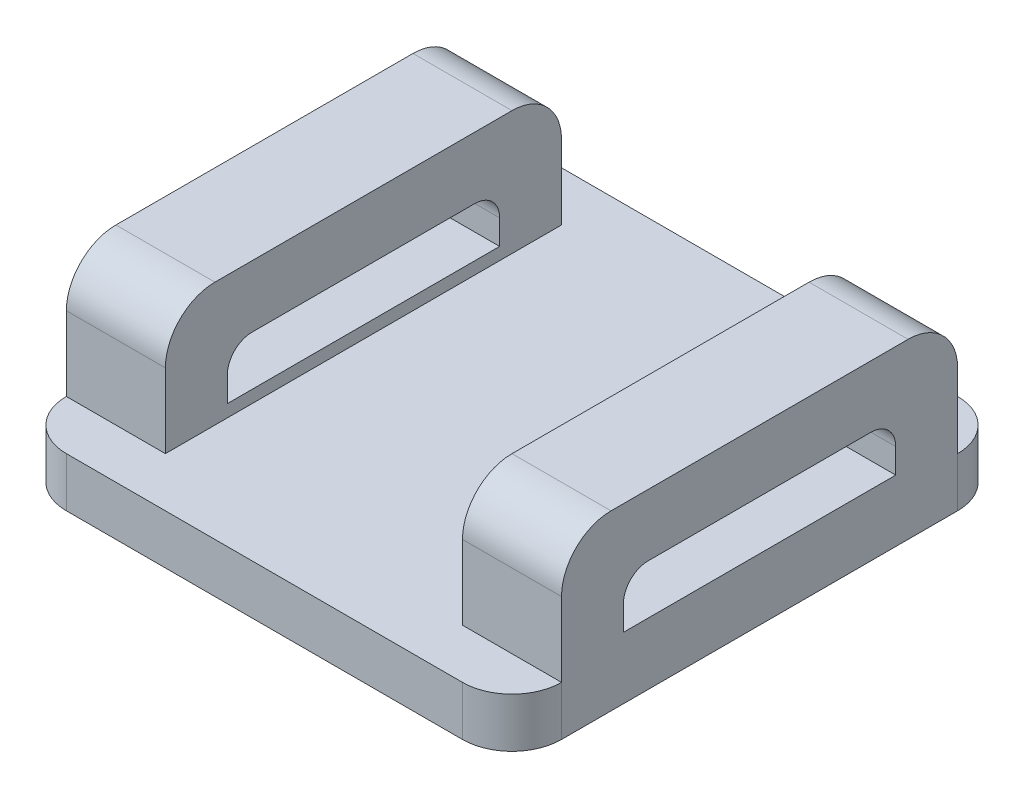
ISO-10303-21;
HEADER;
FILE_DESCRIPTION(('STEP AP214'),'2;1');
FILE_NAME('part.step','',(''),(''),'','','');
FILE_SCHEMA(('AUTOMOTIVE_DESIGN { 1 0 10303 214 1 1 1 1 }'));
ENDSEC;
DATA;
#1=APPLICATION_CONTEXT('core data for automotive mechanical design processes');
#2=APPLICATION_PROTOCOL_DEFINITION('international standard','automotive_design',2000,#1);
#3=PRODUCT_CONTEXT('',#1,'mechanical');
#4=PRODUCT('Part','Part','',(#3));
#5=PRODUCT_RELATED_PRODUCT_CATEGORY('part','',(#4));
#6=PRODUCT_DEFINITION_FORMATION('','',#4);
#7=PRODUCT_DEFINITION_CONTEXT('part definition',#1,'design');
#8=PRODUCT_DEFINITION('design','',#6,#7);
#9=PRODUCT_DEFINITION_SHAPE('','',#8);
#10=(LENGTH_UNIT() NAMED_UNIT(*) SI_UNIT(.MILLI.,.METRE.));
#11=(NAMED_UNIT(*) PLANE_ANGLE_UNIT() SI_UNIT($,.RADIAN.));
#12=(NAMED_UNIT(*) SI_UNIT($,.STERADIAN.) SOLID_ANGLE_UNIT());
#13=UNCERTAINTY_MEASURE_WITH_UNIT(LENGTH_MEASURE(1.E-05),#10,'distance_accuracy_value','');
#14=(GEOMETRIC_REPRESENTATION_CONTEXT(3) GLOBAL_UNCERTAINTY_ASSIGNED_CONTEXT((#13)) GLOBAL_UNIT_ASSIGNED_CONTEXT((#10,
#11,#12)) REPRESENTATION_CONTEXT('',''));
#15=CARTESIAN_POINT('',(0.,0.,0.));
#16=DIRECTION('',(0.,0.,1.));
#17=DIRECTION('',(1.,0.,0.));
#18=AXIS2_PLACEMENT_3D('',#15,#16,#17);
#19=CARTESIAN_POINT('',(0.,2.,0.));
#20=DIRECTION('',(0.,1.,0.));
#21=DIRECTION('',(0.,0.,1.));
#22=AXIS2_PLACEMENT_3D('',#19,#20,#21);
#23=PLANE('',#22);
#24=DIRECTION('',(-1.,0.,0.));
#25=VECTOR('',#24,1.);
#26=CARTESIAN_POINT('',(3.44525547445256,2.,-9.75182481751824));
#27=LINE('',#26,#25);
#28=CARTESIAN_POINT('',(7.44525547445256,2.,-9.75182481751824));
#29=VERTEX_POINT('',#28);
#30=CARTESIAN_POINT('',(3.44525547445256,2.,-9.75182481751824));
#31=VERTEX_POINT('',#30);
#32=EDGE_CURVE('E350',#29,#31,#27,.T.);
#33=ORIENTED_EDGE('',*,*,#32,.F.);
#34=CARTESIAN_POINT('',(5.44525547445255,2.,-9.75182481751824));
#35=DIRECTION('',(0.,1.,0.));
#36=DIRECTION('',(0.,0.,1.));
#37=AXIS2_PLACEMENT_3D('',#34,#35,#36);
#38=CIRCLE('',#37,2.);
#39=CARTESIAN_POINT('',(5.44525547445255,2.,-11.7518248175182));
#40=VERTEX_POINT('',#39);
#41=EDGE_CURVE('E448',#29,#40,#38,.T.);
#42=ORIENTED_EDGE('',*,*,#41,.T.);
#43=DIRECTION('',(-1.,0.,0.));
#44=VECTOR('',#43,1.);
#45=CARTESIAN_POINT('',(-12.5547445255474,2.,-11.7518248175182));
#46=LINE('',#45,#44);
#47=CARTESIAN_POINT('',(-10.5547445255474,2.,-11.7518248175182));
#48=VERTEX_POINT('',#47);
#49=EDGE_CURVE('E482',#40,#48,#46,.T.);
#50=ORIENTED_EDGE('',*,*,#49,.T.);
#51=CARTESIAN_POINT('',(-10.5547445255474,2.,-9.75182481751824));
#52=DIRECTION('',(0.,1.,0.));
#53=DIRECTION('',(0.,0.,1.));
#54=AXIS2_PLACEMENT_3D('',#51,#52,#53);
#55=CIRCLE('',#54,2.);
#56=CARTESIAN_POINT('',(-12.5547445255474,2.,-9.75182481751824));
#57=VERTEX_POINT('',#56);
#58=EDGE_CURVE('E450',#48,#57,#55,.T.);
#59=ORIENTED_EDGE('',*,*,#58,.T.);
#60=DIRECTION('',(-1.,0.,0.));
#61=VECTOR('',#60,1.);
#62=CARTESIAN_POINT('',(-12.5547445255474,2.,-9.75182481751824));
#63=LINE('',#62,#61);
#64=CARTESIAN_POINT('',(-8.55474452554745,2.,-9.75182481751824));
#65=VERTEX_POINT('',#64);
#66=EDGE_CURVE('E367',#65,#57,#63,.T.);
#67=ORIENTED_EDGE('',*,*,#66,.F.);
#68=DIRECTION('',(0.,0.,-1.));
#69=VECTOR('',#68,1.);
#70=CARTESIAN_POINT('',(-8.55474452554745,2.,-9.75182481751824));
#71=LINE('',#70,#69);
#72=CARTESIAN_POINT('',(-8.55474452554745,2.,6.24817518248176));
#73=VERTEX_POINT('',#72);
#74=EDGE_CURVE('E371',#73,#65,#71,.T.);
#75=ORIENTED_EDGE('',*,*,#74,.F.);
#76=DIRECTION('',(1.,0.,0.));
#77=VECTOR('',#76,1.);
#78=CARTESIAN_POINT('',(-12.5547445255474,2.,6.24817518248176));
#79=LINE('',#78,#77);
#80=CARTESIAN_POINT('',(-12.5547445255474,2.,6.24817518248176));
#81=VERTEX_POINT('',#80);
#82=EDGE_CURVE('E362',#81,#73,#79,.T.);
#83=ORIENTED_EDGE('',*,*,#82,.F.);
#84=CARTESIAN_POINT('',(-10.5547445255474,2.,6.24817518248176));
#85=DIRECTION('',(0.,1.,0.));
#86=DIRECTION('',(0.,0.,1.));
#87=AXIS2_PLACEMENT_3D('',#84,#85,#86);
#88=CIRCLE('',#87,2.);
#89=CARTESIAN_POINT('',(-10.5547445255474,2.,8.24817518248176));
#90=VERTEX_POINT('',#89);
#91=EDGE_CURVE('E458',#81,#90,#88,.T.);
#92=ORIENTED_EDGE('',*,*,#91,.T.);
#93=DIRECTION('',(1.,0.,0.));
#94=VECTOR('',#93,1.);
#95=CARTESIAN_POINT('',(-12.5547445255474,2.,8.24817518248176));
#96=LINE('',#95,#94);
#97=CARTESIAN_POINT('',(5.44525547445256,2.,8.24817518248176));
#98=VERTEX_POINT('',#97);
#99=EDGE_CURVE('E485',#90,#98,#96,.T.);
#100=ORIENTED_EDGE('',*,*,#99,.T.);
#101=CARTESIAN_POINT('',(5.44525547445256,2.,6.24817518248176));
#102=DIRECTION('',(0.,1.,0.));
#103=DIRECTION('',(0.,0.,1.));
#104=AXIS2_PLACEMENT_3D('',#101,#102,#103);
#105=CIRCLE('',#104,2.);
#106=CARTESIAN_POINT('',(7.44525547445256,2.,6.24817518248176));
#107=VERTEX_POINT('',#106);
#108=EDGE_CURVE('E455',#98,#107,#105,.T.);
#109=ORIENTED_EDGE('',*,*,#108,.T.);
#110=DIRECTION('',(1.,0.,0.));
#111=VECTOR('',#110,1.);
#112=CARTESIAN_POINT('',(3.44525547445256,2.,6.24817518248176));
#113=LINE('',#112,#111);
#114=CARTESIAN_POINT('',(3.44525547445256,2.,6.24817518248176));
#115=VERTEX_POINT('',#114);
#116=EDGE_CURVE('E339',#115,#107,#113,.T.);
#117=ORIENTED_EDGE('',*,*,#116,.F.);
#118=DIRECTION('',(0.,0.,1.));
#119=VECTOR('',#118,1.);
#120=CARTESIAN_POINT('',(3.44525547445256,2.,-9.75182481751824));
#121=LINE('',#120,#119);
#122=EDGE_CURVE('E344',#31,#115,#121,.T.);
#123=ORIENTED_EDGE('',*,*,#122,.F.);
#124=EDGE_LOOP('',(#33,#42,#50,#59,#67,#75,#83,#92,#100,#109,#117,#123));
#125=FACE_BOUND('',#124,.T.);
#126=ADVANCED_FACE('F33',(#125),#23,.T.);
#127=CARTESIAN_POINT('',(-12.5547445255474,2.,-11.7518248175182));
#128=DIRECTION('',(1.,0.,0.));
#129=DIRECTION('',(0.,0.,-1.));
#130=AXIS2_PLACEMENT_3D('',#127,#128,#129);
#131=PLANE('',#130);
#132=DIRECTION('',(0.,1.,0.));
#133=VECTOR('',#132,1.);
#134=CARTESIAN_POINT('',(-12.5547445255474,2.,-7.25182481751823));
#135=LINE('',#134,#133);
#136=CARTESIAN_POINT('',(-12.5547445255474,2.5,-7.25182481751823));
#137=VERTEX_POINT('',#136);
#138=CARTESIAN_POINT('',(-12.5547445255474,3.5,-7.25182481751823));
#139=VERTEX_POINT('',#138);
#140=EDGE_CURVE('E333',#137,#139,#135,.T.);
#141=ORIENTED_EDGE('',*,*,#140,.T.);
#142=CARTESIAN_POINT('',(-12.5547445255474,3.5,-6.25182481751823));
#143=DIRECTION('',(1.,0.,0.));
#144=DIRECTION('',(0.,0.,-1.));
#145=AXIS2_PLACEMENT_3D('',#142,#143,#144);
#146=CIRCLE('',#145,1.);
#147=CARTESIAN_POINT('',(-12.5547445255474,4.5,-6.25182481751823));
#148=VERTEX_POINT('',#147);
#149=EDGE_CURVE('E336',#139,#148,#146,.T.);
#150=ORIENTED_EDGE('',*,*,#149,.T.);
#151=DIRECTION('',(0.,0.,1.));
#152=VECTOR('',#151,1.);
#153=CARTESIAN_POINT('',(-12.5547445255474,4.5,-11.7518248175182));
#154=LINE('',#153,#152);
#155=CARTESIAN_POINT('',(-12.5547445255474,4.5,2.74817518248176));
#156=VERTEX_POINT('',#155);
#157=EDGE_CURVE('E311',#148,#156,#154,.T.);
#158=ORIENTED_EDGE('',*,*,#157,.T.);
#159=CARTESIAN_POINT('',(-12.5547445255474,3.5,2.74817518248176));
#160=DIRECTION('',(1.,0.,0.));
#161=DIRECTION('',(0.,0.,-1.));
#162=AXIS2_PLACEMENT_3D('',#159,#160,#161);
#163=CIRCLE('',#162,1.);
#164=CARTESIAN_POINT('',(-12.5547445255474,3.5,3.74817518248176));
#165=VERTEX_POINT('',#164);
#166=EDGE_CURVE('E324',#156,#165,#163,.T.);
#167=ORIENTED_EDGE('',*,*,#166,.T.);
#168=DIRECTION('',(0.,-1.,0.));
#169=VECTOR('',#168,1.);
#170=CARTESIAN_POINT('',(-12.5547445255474,2.,3.74817518248176));
#171=LINE('',#170,#169);
#172=CARTESIAN_POINT('',(-12.5547445255474,2.5,3.74817518248176));
#173=VERTEX_POINT('',#172);
#174=EDGE_CURVE('E327',#165,#173,#171,.T.);
#175=ORIENTED_EDGE('',*,*,#174,.T.);
#176=DIRECTION('',(0.,0.,-1.));
#177=VECTOR('',#176,1.);
#178=CARTESIAN_POINT('',(-12.5547445255474,2.5,-11.7518248175182));
#179=LINE('',#178,#177);
#180=EDGE_CURVE('E330',#173,#137,#179,.T.);
#181=ORIENTED_EDGE('',*,*,#180,.T.);
#182=EDGE_LOOP('',(#141,#150,#158,#167,#175,#181));
#183=FACE_BOUND('',#182,.T.);
#184=DIRECTION('',(0.,0.,1.));
#185=VECTOR('',#184,1.);
#186=CARTESIAN_POINT('',(-12.5547445255474,7.,-9.75182481751824));
#187=LINE('',#186,#185);
#188=CARTESIAN_POINT('',(-12.5547445255474,7.,-7.75182481751824));
#189=VERTEX_POINT('',#188);
#190=CARTESIAN_POINT('',(-12.5547445255474,7.,4.24817518248176));
#191=VERTEX_POINT('',#190);
#192=EDGE_CURVE('E363',#189,#191,#187,.T.);
#193=ORIENTED_EDGE('',*,*,#192,.F.);
#194=CARTESIAN_POINT('',(-12.5547445255474,5.,-7.75182481751824));
#195=DIRECTION('',(1.,0.,0.));
#196=DIRECTION('',(0.,0.,-1.));
#197=AXIS2_PLACEMENT_3D('',#194,#195,#196);
#198=CIRCLE('',#197,2.);
#199=CARTESIAN_POINT('',(-12.5547445255474,5.,-9.75182481751824));
#200=VERTEX_POINT('',#199);
#201=EDGE_CURVE('E399',#189,#200,#198,.F.);
#202=ORIENTED_EDGE('',*,*,#201,.T.);
#203=DIRECTION('',(0.,-1.,0.));
#204=VECTOR('',#203,1.);
#205=CARTESIAN_POINT('',(-12.5547445255474,7.,-9.75182481751824));
#206=LINE('',#205,#204);
#207=EDGE_CURVE('E370',#200,#57,#206,.T.);
#208=ORIENTED_EDGE('',*,*,#207,.T.);
#209=DIRECTION('',(0.,-1.,0.));
#210=VECTOR('',#209,1.);
#211=CARTESIAN_POINT('',(-12.5547445255474,2.,-9.75182481751824));
#212=LINE('',#211,#210);
#213=CARTESIAN_POINT('',(-12.5547445255474,0.,-9.75182481751824));
#214=VERTEX_POINT('',#213);
#215=EDGE_CURVE('E438',#57,#214,#212,.T.);
#216=ORIENTED_EDGE('',*,*,#215,.T.);
#217=DIRECTION('',(0.,0.,1.));
#218=VECTOR('',#217,1.);
#219=CARTESIAN_POINT('',(-12.5547445255474,0.,-11.7518248175182));
#220=LINE('',#219,#218);
#221=CARTESIAN_POINT('',(-12.5547445255474,0.,6.24817518248176));
#222=VERTEX_POINT('',#221);
#223=EDGE_CURVE('E395',#214,#222,#220,.T.);
#224=ORIENTED_EDGE('',*,*,#223,.T.);
#225=DIRECTION('',(0.,-1.,0.));
#226=VECTOR('',#225,1.);
#227=CARTESIAN_POINT('',(-12.5547445255474,2.,6.24817518248176));
#228=LINE('',#227,#226);
#229=EDGE_CURVE('E443',#222,#81,#228,.F.);
#230=ORIENTED_EDGE('',*,*,#229,.T.);
#231=DIRECTION('',(0.,-1.,0.));
#232=VECTOR('',#231,1.);
#233=CARTESIAN_POINT('',(-12.5547445255474,7.,6.24817518248176));
#234=LINE('',#233,#232);
#235=CARTESIAN_POINT('',(-12.5547445255474,5.,6.24817518248176));
#236=VERTEX_POINT('',#235);
#237=EDGE_CURVE('E393',#236,#81,#234,.T.);
#238=ORIENTED_EDGE('',*,*,#237,.F.);
#239=CARTESIAN_POINT('',(-12.5547445255474,5.,4.24817518248176));
#240=DIRECTION('',(1.,0.,0.));
#241=DIRECTION('',(0.,0.,-1.));
#242=AXIS2_PLACEMENT_3D('',#239,#240,#241);
#243=CIRCLE('',#242,2.);
#244=EDGE_CURVE('E397',#236,#191,#243,.F.);
#245=ORIENTED_EDGE('',*,*,#244,.T.);
#246=EDGE_LOOP('',(#193,#202,#208,#216,#224,#230,#238,#245));
#247=FACE_BOUND('',#246,.T.);
#248=ADVANCED_FACE('F555',(#183,#247),#131,.F.);
#249=CARTESIAN_POINT('',(-12.5547445255474,2.,8.24817518248176));
#250=DIRECTION('',(0.,0.,-1.));
#251=DIRECTION('',(-1.,0.,0.));
#252=AXIS2_PLACEMENT_3D('',#249,#250,#251);
#253=PLANE('',#252);
#254=DIRECTION('',(1.,0.,0.));
#255=VECTOR('',#254,1.);
#256=CARTESIAN_POINT('',(-12.5547445255474,0.,8.24817518248176));
#257=LINE('',#256,#255);
#258=CARTESIAN_POINT('',(-10.5547445255474,0.,8.24817518248176));
#259=VERTEX_POINT('',#258);
#260=CARTESIAN_POINT('',(5.44525547445256,0.,8.24817518248176));
#261=VERTEX_POINT('',#260);
#262=EDGE_CURVE('E495',#259,#261,#257,.T.);
#263=ORIENTED_EDGE('',*,*,#262,.T.);
#264=DIRECTION('',(0.,-1.,0.));
#265=VECTOR('',#264,1.);
#266=CARTESIAN_POINT('',(5.44525547445256,2.,8.24817518248176));
#267=LINE('',#266,#265);
#268=EDGE_CURVE('E433',#261,#98,#267,.F.);
#269=ORIENTED_EDGE('',*,*,#268,.T.);
#270=ORIENTED_EDGE('',*,*,#99,.F.);
#271=DIRECTION('',(0.,-1.,0.));
#272=VECTOR('',#271,1.);
#273=CARTESIAN_POINT('',(-10.5547445255474,2.,8.24817518248176));
#274=LINE('',#273,#272);
#275=EDGE_CURVE('E435',#90,#259,#274,.T.);
#276=ORIENTED_EDGE('',*,*,#275,.T.);
#277=EDGE_LOOP('',(#263,#269,#270,#276));
#278=FACE_BOUND('',#277,.T.);
#279=ADVANCED_FACE('F520',(#278),#253,.F.);
#280=CARTESIAN_POINT('',(7.44525547445255,2.,-11.7518248175182));
#281=DIRECTION('',(-1.,0.,0.));
#282=DIRECTION('',(0.,0.,1.));
#283=AXIS2_PLACEMENT_3D('',#280,#281,#282);
#284=PLANE('',#283);
#285=DIRECTION('',(0.,0.,-1.));
#286=VECTOR('',#285,1.);
#287=CARTESIAN_POINT('',(7.44525547445255,4.5,-11.7518248175182));
#288=LINE('',#287,#286);
#289=CARTESIAN_POINT('',(7.44525547445255,4.5,2.74817518248175));
#290=VERTEX_POINT('',#289);
#291=CARTESIAN_POINT('',(7.44525547445255,4.5,-6.25182481751824));
#292=VERTEX_POINT('',#291);
#293=EDGE_CURVE('E285',#290,#292,#288,.T.);
#294=ORIENTED_EDGE('',*,*,#293,.T.);
#295=CARTESIAN_POINT('',(7.44525547445255,3.5,-6.25182481751824));
#296=DIRECTION('',(-1.,0.,0.));
#297=DIRECTION('',(0.,0.,1.));
#298=AXIS2_PLACEMENT_3D('',#295,#296,#297);
#299=CIRCLE('',#298,1.);
#300=CARTESIAN_POINT('',(7.44525547445255,3.5,-7.25182481751824));
#301=VERTEX_POINT('',#300);
#302=EDGE_CURVE('E288',#292,#301,#299,.T.);
#303=ORIENTED_EDGE('',*,*,#302,.T.);
#304=DIRECTION('',(0.,-1.,0.));
#305=VECTOR('',#304,1.);
#306=CARTESIAN_POINT('',(7.44525547445255,2.,-7.25182481751823));
#307=LINE('',#306,#305);
#308=CARTESIAN_POINT('',(7.44525547445255,2.5,-7.25182481751823));
#309=VERTEX_POINT('',#308);
#310=EDGE_CURVE('E270',#301,#309,#307,.T.);
#311=ORIENTED_EDGE('',*,*,#310,.T.);
#312=DIRECTION('',(0.,0.,1.));
#313=VECTOR('',#312,1.);
#314=CARTESIAN_POINT('',(7.44525547445255,2.5,-11.7518248175182));
#315=LINE('',#314,#313);
#316=CARTESIAN_POINT('',(7.44525547445255,2.5,3.74817518248175));
#317=VERTEX_POINT('',#316);
#318=EDGE_CURVE('E238',#309,#317,#315,.T.);
#319=ORIENTED_EDGE('',*,*,#318,.T.);
#320=DIRECTION('',(0.,1.,0.));
#321=VECTOR('',#320,1.);
#322=CARTESIAN_POINT('',(7.44525547445255,2.00000000000001,3.74817518248175));
#323=LINE('',#322,#321);
#324=CARTESIAN_POINT('',(7.44525547445255,3.5,3.74817518248175));
#325=VERTEX_POINT('',#324);
#326=EDGE_CURVE('E279',#317,#325,#323,.T.);
#327=ORIENTED_EDGE('',*,*,#326,.T.);
#328=CARTESIAN_POINT('',(7.44525547445255,3.5,2.74817518248175));
#329=DIRECTION('',(-1.,0.,0.));
#330=DIRECTION('',(0.,0.,1.));
#331=AXIS2_PLACEMENT_3D('',#328,#329,#330);
#332=CIRCLE('',#331,1.);
#333=EDGE_CURVE('E282',#325,#290,#332,.T.);
#334=ORIENTED_EDGE('',*,*,#333,.T.);
#335=EDGE_LOOP('',(#294,#303,#311,#319,#327,#334));
#336=FACE_BOUND('',#335,.T.);
#337=DIRECTION('',(0.,-1.,0.));
#338=VECTOR('',#337,1.);
#339=CARTESIAN_POINT('',(7.44525547445256,7.,-9.75182481751824));
#340=LINE('',#339,#338);
#341=CARTESIAN_POINT('',(7.44525547445256,5.,-9.75182481751824));
#342=VERTEX_POINT('',#341);
#343=EDGE_CURVE('E358',#342,#29,#340,.T.);
#344=ORIENTED_EDGE('',*,*,#343,.F.);
#345=CARTESIAN_POINT('',(7.44525547445255,5.,-7.75182481751824));
#346=DIRECTION('',(-1.,0.,0.));
#347=DIRECTION('',(0.,0.,1.));
#348=AXIS2_PLACEMENT_3D('',#345,#346,#347);
#349=CIRCLE('',#348,2.);
#350=CARTESIAN_POINT('',(7.44525547445256,7.,-7.75182481751824));
#351=VERTEX_POINT('',#350);
#352=EDGE_CURVE('E415',#342,#351,#349,.F.);
#353=ORIENTED_EDGE('',*,*,#352,.T.);
#354=DIRECTION('',(0.,0.,-1.));
#355=VECTOR('',#354,1.);
#356=CARTESIAN_POINT('',(7.44525547445256,7.,-9.75182481751824));
#357=LINE('',#356,#355);
#358=CARTESIAN_POINT('',(7.44525547445256,7.,4.24817518248176));
#359=VERTEX_POINT('',#358);
#360=EDGE_CURVE('E340',#359,#351,#357,.T.);
#361=ORIENTED_EDGE('',*,*,#360,.F.);
#362=CARTESIAN_POINT('',(7.44525547445255,5.,4.24817518248176));
#363=DIRECTION('',(-1.,0.,0.));
#364=DIRECTION('',(0.,0.,1.));
#365=AXIS2_PLACEMENT_3D('',#362,#363,#364);
#366=CIRCLE('',#365,2.);
#367=CARTESIAN_POINT('',(7.44525547445256,5.,6.24817518248176));
#368=VERTEX_POINT('',#367);
#369=EDGE_CURVE('E419',#359,#368,#366,.F.);
#370=ORIENTED_EDGE('',*,*,#369,.T.);
#371=DIRECTION('',(0.,-1.,0.));
#372=VECTOR('',#371,1.);
#373=CARTESIAN_POINT('',(7.44525547445256,7.,6.24817518248176));
#374=LINE('',#373,#372);
#375=EDGE_CURVE('E360',#368,#107,#374,.T.);
#376=ORIENTED_EDGE('',*,*,#375,.T.);
#377=DIRECTION('',(0.,-1.,0.));
#378=VECTOR('',#377,1.);
#379=CARTESIAN_POINT('',(7.44525547445256,2.,6.24817518248176));
#380=LINE('',#379,#378);
#381=CARTESIAN_POINT('',(7.44525547445256,0.,6.24817518248176));
#382=VERTEX_POINT('',#381);
#383=EDGE_CURVE('E465',#107,#382,#380,.T.);
#384=ORIENTED_EDGE('',*,*,#383,.T.);
#385=DIRECTION('',(0.,0.,-1.));
#386=VECTOR('',#385,1.);
#387=CARTESIAN_POINT('',(7.44525547445255,0.,-11.7518248175182));
#388=LINE('',#387,#386);
#389=CARTESIAN_POINT('',(7.44525547445255,0.,-9.75182481751824));
#390=VERTEX_POINT('',#389);
#391=EDGE_CURVE('E498',#382,#390,#388,.T.);
#392=ORIENTED_EDGE('',*,*,#391,.T.);
#393=DIRECTION('',(0.,-1.,0.));
#394=VECTOR('',#393,1.);
#395=CARTESIAN_POINT('',(7.44525547445255,2.,-9.75182481751824));
#396=LINE('',#395,#394);
#397=EDGE_CURVE('E462',#390,#29,#396,.F.);
#398=ORIENTED_EDGE('',*,*,#397,.T.);
#399=EDGE_LOOP('',(#344,#353,#361,#370,#376,#384,#392,#398));
#400=FACE_BOUND('',#399,.T.);
#401=ADVANCED_FACE('F532',(#336,#400),#284,.F.);
#402=CARTESIAN_POINT('',(-12.5547445255474,2.,-11.7518248175182));
#403=DIRECTION('',(0.,0.,1.));
#404=DIRECTION('',(1.,0.,0.));
#405=AXIS2_PLACEMENT_3D('',#402,#403,#404);
#406=PLANE('',#405);
#407=ORIENTED_EDGE('',*,*,#49,.F.);
#408=DIRECTION('',(0.,-1.,0.));
#409=VECTOR('',#408,1.);
#410=CARTESIAN_POINT('',(5.44525547445255,2.,-11.7518248175182));
#411=LINE('',#410,#409);
#412=CARTESIAN_POINT('',(5.44525547445255,0.,-11.7518248175182));
#413=VERTEX_POINT('',#412);
#414=EDGE_CURVE('E475',#40,#413,#411,.T.);
#415=ORIENTED_EDGE('',*,*,#414,.T.);
#416=DIRECTION('',(-1.,0.,0.));
#417=VECTOR('',#416,1.);
#418=CARTESIAN_POINT('',(-12.5547445255474,0.,-11.7518248175182));
#419=LINE('',#418,#417);
#420=CARTESIAN_POINT('',(-10.5547445255474,0.,-11.7518248175182));
#421=VERTEX_POINT('',#420);
#422=EDGE_CURVE('E490',#413,#421,#419,.T.);
#423=ORIENTED_EDGE('',*,*,#422,.T.);
#424=DIRECTION('',(0.,-1.,0.));
#425=VECTOR('',#424,1.);
#426=CARTESIAN_POINT('',(-10.5547445255474,2.,-11.7518248175182));
#427=LINE('',#426,#425);
#428=EDGE_CURVE('E386',#421,#48,#427,.F.);
#429=ORIENTED_EDGE('',*,*,#428,.T.);
#430=EDGE_LOOP('',(#407,#415,#423,#429));
#431=FACE_BOUND('',#430,.T.);
#432=ADVANCED_FACE('F549',(#431),#406,.F.);
#433=CARTESIAN_POINT('',(0.,0.,0.));
#434=DIRECTION('',(0.,1.,0.));
#435=DIRECTION('',(0.,0.,1.));
#436=AXIS2_PLACEMENT_3D('',#433,#434,#435);
#437=PLANE('',#436);
#438=ORIENTED_EDGE('',*,*,#422,.F.);
#439=CARTESIAN_POINT('',(5.44525547445255,0.,-9.75182481751824));
#440=DIRECTION('',(0.,1.,0.));
#441=DIRECTION('',(0.,0.,1.));
#442=AXIS2_PLACEMENT_3D('',#439,#440,#441);
#443=CIRCLE('',#442,2.);
#444=EDGE_CURVE('E468',#413,#390,#443,.F.);
#445=ORIENTED_EDGE('',*,*,#444,.T.);
#446=ORIENTED_EDGE('',*,*,#391,.F.);
#447=CARTESIAN_POINT('',(5.44525547445256,0.,6.24817518248176));
#448=DIRECTION('',(0.,1.,0.));
#449=DIRECTION('',(0.,0.,1.));
#450=AXIS2_PLACEMENT_3D('',#447,#448,#449);
#451=CIRCLE('',#450,2.);
#452=EDGE_CURVE('E472',#382,#261,#451,.F.);
#453=ORIENTED_EDGE('',*,*,#452,.T.);
#454=ORIENTED_EDGE('',*,*,#262,.F.);
#455=CARTESIAN_POINT('',(-10.5547445255474,0.,6.24817518248176));
#456=DIRECTION('',(0.,1.,0.));
#457=DIRECTION('',(0.,0.,1.));
#458=AXIS2_PLACEMENT_3D('',#455,#456,#457);
#459=CIRCLE('',#458,2.);
#460=EDGE_CURVE('E474',#259,#222,#459,.F.);
#461=ORIENTED_EDGE('',*,*,#460,.T.);
#462=ORIENTED_EDGE('',*,*,#223,.F.);
#463=CARTESIAN_POINT('',(-10.5547445255474,0.,-9.75182481751824));
#464=DIRECTION('',(0.,1.,0.));
#465=DIRECTION('',(0.,0.,1.));
#466=AXIS2_PLACEMENT_3D('',#463,#464,#465);
#467=CIRCLE('',#466,2.);
#468=EDGE_CURVE('E470',#214,#421,#467,.F.);
#469=ORIENTED_EDGE('',*,*,#468,.T.);
#470=EDGE_LOOP('',(#438,#445,#446,#453,#454,#461,#462,#469));
#471=FACE_BOUND('',#470,.T.);
#472=ADVANCED_FACE('F523',(#471),#437,.F.);
#473=CARTESIAN_POINT('',(-12.5547445255474,7.,6.24817518248176));
#474=DIRECTION('',(0.,0.,-1.));
#475=DIRECTION('',(-1.,0.,0.));
#476=AXIS2_PLACEMENT_3D('',#473,#474,#475);
#477=PLANE('',#476);
#478=DIRECTION('',(0.,-1.,0.));
#479=VECTOR('',#478,1.);
#480=CARTESIAN_POINT('',(-8.55474452554745,7.,6.24817518248176));
#481=LINE('',#480,#479);
#482=CARTESIAN_POINT('',(-8.55474452554745,5.,6.24817518248176));
#483=VERTEX_POINT('',#482);
#484=EDGE_CURVE('E396',#483,#73,#481,.T.);
#485=ORIENTED_EDGE('',*,*,#484,.F.);
#486=DIRECTION('',(1.,0.,0.));
#487=VECTOR('',#486,1.);
#488=CARTESIAN_POINT('',(-12.5547445255474,5.,6.24817518248176));
#489=LINE('',#488,#487);
#490=EDGE_CURVE('E11',#483,#236,#489,.F.);
#491=ORIENTED_EDGE('',*,*,#490,.T.);
#492=ORIENTED_EDGE('',*,*,#237,.T.);
#493=ORIENTED_EDGE('',*,*,#82,.T.);
#494=EDGE_LOOP('',(#485,#491,#492,#493));
#495=FACE_BOUND('',#494,.T.);
#496=ADVANCED_FACE('F506',(#495),#477,.F.);
#497=CARTESIAN_POINT('',(-8.55474452554745,7.,-9.75182481751824));
#498=DIRECTION('',(-1.,0.,0.));
#499=DIRECTION('',(0.,0.,1.));
#500=AXIS2_PLACEMENT_3D('',#497,#498,#499);
#501=PLANE('',#500);
#502=DIRECTION('',(0.,0.,1.));
#503=VECTOR('',#502,1.);
#504=CARTESIAN_POINT('',(-8.55474452554745,4.5,-6.25182481751823));
#505=LINE('',#504,#503);
#506=CARTESIAN_POINT('',(-8.55474452554745,4.5,-6.25182481751823));
#507=VERTEX_POINT('',#506);
#508=CARTESIAN_POINT('',(-8.55474452554745,4.5,2.74817518248176));
#509=VERTEX_POINT('',#508);
#510=EDGE_CURVE('E293',#507,#509,#505,.T.);
#511=ORIENTED_EDGE('',*,*,#510,.F.);
#512=CARTESIAN_POINT('',(-8.55474452554745,3.5,-6.25182481751823));
#513=DIRECTION('',(1.,0.,0.));
#514=DIRECTION('',(0.,0.,1.));
#515=AXIS2_PLACEMENT_3D('',#512,#513,#514);
#516=CIRCLE('',#515,1.);
#517=CARTESIAN_POINT('',(-8.55474452554745,3.5,-7.25182481751823));
#518=VERTEX_POINT('',#517);
#519=EDGE_CURVE('E291',#518,#507,#516,.T.);
#520=ORIENTED_EDGE('',*,*,#519,.F.);
#521=DIRECTION('',(0.,1.,0.));
#522=VECTOR('',#521,1.);
#523=CARTESIAN_POINT('',(-8.55474452554745,3.5,-7.25182481751823));
#524=LINE('',#523,#522);
#525=CARTESIAN_POINT('',(-8.55474452554745,2.5,-7.25182481751823));
#526=VERTEX_POINT('',#525);
#527=EDGE_CURVE('E305',#526,#518,#524,.T.);
#528=ORIENTED_EDGE('',*,*,#527,.F.);
#529=DIRECTION('',(0.,0.,-1.));
#530=VECTOR('',#529,1.);
#531=CARTESIAN_POINT('',(-8.55474452554745,2.5,3.74817518248176));
#532=LINE('',#531,#530);
#533=CARTESIAN_POINT('',(-8.55474452554745,2.5,3.74817518248176));
#534=VERTEX_POINT('',#533);
#535=EDGE_CURVE('E302',#534,#526,#532,.T.);
#536=ORIENTED_EDGE('',*,*,#535,.F.);
#537=DIRECTION('',(0.,-1.,0.));
#538=VECTOR('',#537,1.);
#539=CARTESIAN_POINT('',(-8.55474452554745,3.5,3.74817518248176));
#540=LINE('',#539,#538);
#541=CARTESIAN_POINT('',(-8.55474452554745,3.5,3.74817518248176));
#542=VERTEX_POINT('',#541);
#543=EDGE_CURVE('E299',#542,#534,#540,.T.);
#544=ORIENTED_EDGE('',*,*,#543,.F.);
#545=CARTESIAN_POINT('',(-8.55474452554745,3.5,2.74817518248176));
#546=DIRECTION('',(1.,0.,0.));
#547=DIRECTION('',(0.,0.,1.));
#548=AXIS2_PLACEMENT_3D('',#545,#546,#547);
#549=CIRCLE('',#548,1.);
#550=EDGE_CURVE('E296',#509,#542,#549,.T.);
#551=ORIENTED_EDGE('',*,*,#550,.F.);
#552=EDGE_LOOP('',(#511,#520,#528,#536,#544,#551));
#553=FACE_BOUND('',#552,.T.);
#554=DIRECTION('',(0.,-1.,0.));
#555=VECTOR('',#554,1.);
#556=CARTESIAN_POINT('',(-8.55474452554745,7.,-9.75182481751824));
#557=LINE('',#556,#555);
#558=CARTESIAN_POINT('',(-8.55474452554745,5.,-9.75182481751824));
#559=VERTEX_POINT('',#558);
#560=EDGE_CURVE('E376',#559,#65,#557,.T.);
#561=ORIENTED_EDGE('',*,*,#560,.F.);
#562=CARTESIAN_POINT('',(-8.55474452554745,5.,-7.75182481751824));
#563=DIRECTION('',(-1.,0.,0.));
#564=DIRECTION('',(0.,0.,1.));
#565=AXIS2_PLACEMENT_3D('',#562,#563,#564);
#566=CIRCLE('',#565,2.);
#567=CARTESIAN_POINT('',(-8.55474452554745,7.,-7.75182481751824));
#568=VERTEX_POINT('',#567);
#569=EDGE_CURVE('E41',#559,#568,#566,.F.);
#570=ORIENTED_EDGE('',*,*,#569,.T.);
#571=DIRECTION('',(0.,0.,-1.));
#572=VECTOR('',#571,1.);
#573=CARTESIAN_POINT('',(-8.55474452554745,7.,-9.75182481751824));
#574=LINE('',#573,#572);
#575=CARTESIAN_POINT('',(-8.55474452554745,7.,4.24817518248176));
#576=VERTEX_POINT('',#575);
#577=EDGE_CURVE('E366',#576,#568,#574,.T.);
#578=ORIENTED_EDGE('',*,*,#577,.F.);
#579=CARTESIAN_POINT('',(-8.55474452554745,5.,4.24817518248176));
#580=DIRECTION('',(-1.,0.,0.));
#581=DIRECTION('',(0.,0.,1.));
#582=AXIS2_PLACEMENT_3D('',#579,#580,#581);
#583=CIRCLE('',#582,2.);
#584=EDGE_CURVE('E48',#576,#483,#583,.F.);
#585=ORIENTED_EDGE('',*,*,#584,.T.);
#586=ORIENTED_EDGE('',*,*,#484,.T.);
#587=ORIENTED_EDGE('',*,*,#74,.T.);
#588=EDGE_LOOP('',(#561,#570,#578,#585,#586,#587));
#589=FACE_BOUND('',#588,.T.);
#590=ADVANCED_FACE('F403',(#553,#589),#501,.F.);
#591=CARTESIAN_POINT('',(-12.5547445255474,7.,-9.75182481751824));
#592=DIRECTION('',(0.,0.,1.));
#593=DIRECTION('',(1.,0.,0.));
#594=AXIS2_PLACEMENT_3D('',#591,#592,#593);
#595=PLANE('',#594);
#596=ORIENTED_EDGE('',*,*,#207,.F.);
#597=DIRECTION('',(-1.,0.,0.));
#598=VECTOR('',#597,1.);
#599=CARTESIAN_POINT('',(-8.55474452554745,5.,-9.75182481751824));
#600=LINE('',#599,#598);
#601=EDGE_CURVE('E56',#200,#559,#600,.F.);
#602=ORIENTED_EDGE('',*,*,#601,.T.);
#603=ORIENTED_EDGE('',*,*,#560,.T.);
#604=ORIENTED_EDGE('',*,*,#66,.T.);
#605=EDGE_LOOP('',(#596,#602,#603,#604));
#606=FACE_BOUND('',#605,.T.);
#607=ADVANCED_FACE('F553',(#606),#595,.F.);
#608=CARTESIAN_POINT('',(0.,7.,0.));
#609=DIRECTION('',(0.,1.,0.));
#610=DIRECTION('',(0.,0.,1.));
#611=AXIS2_PLACEMENT_3D('',#608,#609,#610);
#612=PLANE('',#611);
#613=ORIENTED_EDGE('',*,*,#577,.T.);
#614=DIRECTION('',(-1.,0.,0.));
#615=VECTOR('',#614,1.);
#616=CARTESIAN_POINT('',(-12.5547445255474,7.,-7.75182481751824));
#617=LINE('',#616,#615);
#618=EDGE_CURVE('E391',#568,#189,#617,.T.);
#619=ORIENTED_EDGE('',*,*,#618,.T.);
#620=ORIENTED_EDGE('',*,*,#192,.T.);
#621=DIRECTION('',(1.,0.,0.));
#622=VECTOR('',#621,1.);
#623=CARTESIAN_POINT('',(-8.55474452554745,7.,4.24817518248176));
#624=LINE('',#623,#622);
#625=EDGE_CURVE('E412',#191,#576,#624,.T.);
#626=ORIENTED_EDGE('',*,*,#625,.T.);
#627=EDGE_LOOP('',(#613,#619,#620,#626));
#628=FACE_BOUND('',#627,.T.);
#629=ADVANCED_FACE('F409',(#628),#612,.T.);
#630=CARTESIAN_POINT('',(3.44525547445256,7.,6.24817518248176));
#631=DIRECTION('',(0.,0.,-1.));
#632=DIRECTION('',(-1.,0.,0.));
#633=AXIS2_PLACEMENT_3D('',#630,#631,#632);
#634=PLANE('',#633);
#635=ORIENTED_EDGE('',*,*,#375,.F.);
#636=DIRECTION('',(1.,0.,0.));
#637=VECTOR('',#636,1.);
#638=CARTESIAN_POINT('',(3.44525547445256,5.,6.24817518248176));
#639=LINE('',#638,#637);
#640=CARTESIAN_POINT('',(3.44525547445256,5.,6.24817518248176));
#641=VERTEX_POINT('',#640);
#642=EDGE_CURVE('E414',#368,#641,#639,.F.);
#643=ORIENTED_EDGE('',*,*,#642,.T.);
#644=DIRECTION('',(0.,-1.,0.));
#645=VECTOR('',#644,1.);
#646=CARTESIAN_POINT('',(3.44525547445256,7.,6.24817518248176));
#647=LINE('',#646,#645);
#648=EDGE_CURVE('E347',#641,#115,#647,.T.);
#649=ORIENTED_EDGE('',*,*,#648,.T.);
#650=ORIENTED_EDGE('',*,*,#116,.T.);
#651=EDGE_LOOP('',(#635,#643,#649,#650));
#652=FACE_BOUND('',#651,.T.);
#653=ADVANCED_FACE('F540',(#652),#634,.F.);
#654=CARTESIAN_POINT('',(3.44525547445256,7.,-9.75182481751824));
#655=DIRECTION('',(0.,0.,1.));
#656=DIRECTION('',(1.,0.,0.));
#657=AXIS2_PLACEMENT_3D('',#654,#655,#656);
#658=PLANE('',#657);
#659=DIRECTION('',(0.,-1.,0.));
#660=VECTOR('',#659,1.);
#661=CARTESIAN_POINT('',(3.44525547445256,7.,-9.75182481751824));
#662=LINE('',#661,#660);
#663=CARTESIAN_POINT('',(3.44525547445256,5.,-9.75182481751824));
#664=VERTEX_POINT('',#663);
#665=EDGE_CURVE('E356',#664,#31,#662,.T.);
#666=ORIENTED_EDGE('',*,*,#665,.F.);
#667=DIRECTION('',(-1.,0.,0.));
#668=VECTOR('',#667,1.);
#669=CARTESIAN_POINT('',(3.44525547445256,5.,-9.75182481751824));
#670=LINE('',#669,#668);
#671=EDGE_CURVE('E421',#664,#342,#670,.F.);
#672=ORIENTED_EDGE('',*,*,#671,.T.);
#673=ORIENTED_EDGE('',*,*,#343,.T.);
#674=ORIENTED_EDGE('',*,*,#32,.T.);
#675=EDGE_LOOP('',(#666,#672,#673,#674));
#676=FACE_BOUND('',#675,.T.);
#677=ADVANCED_FACE('F604',(#676),#658,.F.);
#678=CARTESIAN_POINT('',(3.44525547445256,7.,-9.75182481751824));
#679=DIRECTION('',(1.,0.,0.));
#680=DIRECTION('',(0.,0.,-1.));
#681=AXIS2_PLACEMENT_3D('',#678,#679,#680);
#682=PLANE('',#681);
#683=DIRECTION('',(0.,-1.,0.));
#684=VECTOR('',#683,1.);
#685=CARTESIAN_POINT('',(3.44525547445256,3.5,-7.25182481751824));
#686=LINE('',#685,#684);
#687=CARTESIAN_POINT('',(3.44525547445256,3.5,-7.25182481751823));
#688=VERTEX_POINT('',#687);
#689=CARTESIAN_POINT('',(3.44525547445256,2.5,-7.25182481751823));
#690=VERTEX_POINT('',#689);
#691=EDGE_CURVE('E246',#688,#690,#686,.T.);
#692=ORIENTED_EDGE('',*,*,#691,.F.);
#693=CARTESIAN_POINT('',(3.44525547445256,3.5,-6.25182481751824));
#694=DIRECTION('',(-1.,0.,0.));
#695=DIRECTION('',(0.,0.,1.));
#696=AXIS2_PLACEMENT_3D('',#693,#694,#695);
#697=CIRCLE('',#696,1.);
#698=CARTESIAN_POINT('',(3.44525547445256,4.5,-6.25182481751824));
#699=VERTEX_POINT('',#698);
#700=EDGE_CURVE('E251',#699,#688,#697,.T.);
#701=ORIENTED_EDGE('',*,*,#700,.F.);
#702=DIRECTION('',(0.,0.,-1.));
#703=VECTOR('',#702,1.);
#704=CARTESIAN_POINT('',(3.44525547445256,4.5,2.74817518248175));
#705=LINE('',#704,#703);
#706=CARTESIAN_POINT('',(3.44525547445256,4.5,2.74817518248175));
#707=VERTEX_POINT('',#706);
#708=EDGE_CURVE('E265',#707,#699,#705,.T.);
#709=ORIENTED_EDGE('',*,*,#708,.F.);
#710=CARTESIAN_POINT('',(3.44525547445256,3.5,2.74817518248175));
#711=DIRECTION('',(-1.,0.,0.));
#712=DIRECTION('',(0.,0.,1.));
#713=AXIS2_PLACEMENT_3D('',#710,#711,#712);
#714=CIRCLE('',#713,1.);
#715=CARTESIAN_POINT('',(3.44525547445256,3.5,3.74817518248175));
#716=VERTEX_POINT('',#715);
#717=EDGE_CURVE('E259',#716,#707,#714,.T.);
#718=ORIENTED_EDGE('',*,*,#717,.F.);
#719=DIRECTION('',(0.,1.,0.));
#720=VECTOR('',#719,1.);
#721=CARTESIAN_POINT('',(3.44525547445256,3.5,3.74817518248175));
#722=LINE('',#721,#720);
#723=CARTESIAN_POINT('',(3.44525547445256,2.5,3.74817518248175));
#724=VERTEX_POINT('',#723);
#725=EDGE_CURVE('E257',#724,#716,#722,.T.);
#726=ORIENTED_EDGE('',*,*,#725,.F.);
#727=DIRECTION('',(0.,0.,1.));
#728=VECTOR('',#727,1.);
#729=CARTESIAN_POINT('',(3.44525547445256,2.5,-7.25182481751823));
#730=LINE('',#729,#728);
#731=EDGE_CURVE('E235',#690,#724,#730,.T.);
#732=ORIENTED_EDGE('',*,*,#731,.F.);
#733=EDGE_LOOP('',(#692,#701,#709,#718,#726,#732));
#734=FACE_BOUND('',#733,.T.);
#735=DIRECTION('',(0.,0.,1.));
#736=VECTOR('',#735,1.);
#737=CARTESIAN_POINT('',(3.44525547445256,7.,-9.75182481751824));
#738=LINE('',#737,#736);
#739=CARTESIAN_POINT('',(3.44525547445256,7.,-7.75182481751824));
#740=VERTEX_POINT('',#739);
#741=CARTESIAN_POINT('',(3.44525547445256,7.,4.24817518248176));
#742=VERTEX_POINT('',#741);
#743=EDGE_CURVE('E343',#740,#742,#738,.T.);
#744=ORIENTED_EDGE('',*,*,#743,.F.);
#745=CARTESIAN_POINT('',(3.44525547445256,5.,-7.75182481751824));
#746=DIRECTION('',(1.,0.,0.));
#747=DIRECTION('',(0.,0.,-1.));
#748=AXIS2_PLACEMENT_3D('',#745,#746,#747);
#749=CIRCLE('',#748,2.);
#750=EDGE_CURVE('E423',#740,#664,#749,.F.);
#751=ORIENTED_EDGE('',*,*,#750,.T.);
#752=ORIENTED_EDGE('',*,*,#665,.T.);
#753=ORIENTED_EDGE('',*,*,#122,.T.);
#754=ORIENTED_EDGE('',*,*,#648,.F.);
#755=CARTESIAN_POINT('',(3.44525547445256,5.,4.24817518248176));
#756=DIRECTION('',(1.,0.,0.));
#757=DIRECTION('',(0.,0.,-1.));
#758=AXIS2_PLACEMENT_3D('',#755,#756,#757);
#759=CIRCLE('',#758,2.);
#760=EDGE_CURVE('E425',#641,#742,#759,.F.);
#761=ORIENTED_EDGE('',*,*,#760,.T.);
#762=EDGE_LOOP('',(#744,#751,#752,#753,#754,#761));
#763=FACE_BOUND('',#762,.T.);
#764=ADVANCED_FACE('F253',(#734,#763),#682,.F.);
#765=CARTESIAN_POINT('',(0.,7.,0.));
#766=DIRECTION('',(0.,-1.,0.));
#767=DIRECTION('',(0.,0.,-1.));
#768=AXIS2_PLACEMENT_3D('',#765,#766,#767);
#769=PLANE('',#768);
#770=ORIENTED_EDGE('',*,*,#360,.T.);
#771=DIRECTION('',(-1.,0.,0.));
#772=VECTOR('',#771,1.);
#773=CARTESIAN_POINT('',(0.,7.,-7.75182481751824));
#774=LINE('',#773,#772);
#775=EDGE_CURVE('E427',#351,#740,#774,.T.);
#776=ORIENTED_EDGE('',*,*,#775,.T.);
#777=ORIENTED_EDGE('',*,*,#743,.T.);
#778=DIRECTION('',(1.,0.,0.));
#779=VECTOR('',#778,1.);
#780=CARTESIAN_POINT('',(0.,7.,4.24817518248176));
#781=LINE('',#780,#779);
#782=EDGE_CURVE('E430',#742,#359,#781,.T.);
#783=ORIENTED_EDGE('',*,*,#782,.T.);
#784=EDGE_LOOP('',(#770,#776,#777,#783));
#785=FACE_BOUND('',#784,.T.);
#786=ADVANCED_FACE('F600',(#785),#769,.F.);
#787=CARTESIAN_POINT('',(-13.5547445255474,3.5,-6.25182481751823));
#788=DIRECTION('',(1.,0.,0.));
#789=DIRECTION('',(0.,0.,-1.));
#790=AXIS2_PLACEMENT_3D('',#787,#788,#789);
#791=CYLINDRICAL_SURFACE('',#790,1.);
#792=DIRECTION('',(1.,0.,0.));
#793=VECTOR('',#792,1.);
#794=CARTESIAN_POINT('',(-13.5547445255474,3.5,-7.25182481751823));
#795=LINE('',#794,#793);
#796=EDGE_CURVE('E309',#139,#518,#795,.T.);
#797=ORIENTED_EDGE('',*,*,#796,.T.);
#798=ORIENTED_EDGE('',*,*,#519,.T.);
#799=DIRECTION('',(1.,0.,0.));
#800=VECTOR('',#799,1.);
#801=CARTESIAN_POINT('',(-13.5547445255474,4.5,-6.25182481751823));
#802=LINE('',#801,#800);
#803=EDGE_CURVE('E308',#148,#507,#802,.T.);
#804=ORIENTED_EDGE('',*,*,#803,.F.);
#805=ORIENTED_EDGE('',*,*,#149,.F.);
#806=EDGE_LOOP('',(#797,#798,#804,#805));
#807=FACE_BOUND('',#806,.T.);
#808=ADVANCED_FACE('F633',(#807),#791,.F.);
#809=CARTESIAN_POINT('',(-13.5547445255474,3.5,-7.25182481751823));
#810=DIRECTION('',(0.,0.,-1.));
#811=DIRECTION('',(0.,1.,0.));
#812=AXIS2_PLACEMENT_3D('',#809,#810,#811);
#813=PLANE('',#812);
#814=DIRECTION('',(1.,0.,0.));
#815=VECTOR('',#814,1.);
#816=CARTESIAN_POINT('',(-13.5547445255474,2.5,-7.25182481751823));
#817=LINE('',#816,#815);
#818=EDGE_CURVE('E312',#137,#526,#817,.T.);
#819=ORIENTED_EDGE('',*,*,#818,.T.);
#820=ORIENTED_EDGE('',*,*,#527,.T.);
#821=ORIENTED_EDGE('',*,*,#796,.F.);
#822=ORIENTED_EDGE('',*,*,#140,.F.);
#823=EDGE_LOOP('',(#819,#820,#821,#822));
#824=FACE_BOUND('',#823,.T.);
#825=ADVANCED_FACE('F637',(#824),#813,.F.);
#826=CARTESIAN_POINT('',(-13.5547445255474,2.5,3.74817518248176));
#827=DIRECTION('',(0.,-1.,0.));
#828=DIRECTION('',(0.,0.,-1.));
#829=AXIS2_PLACEMENT_3D('',#826,#827,#828);
#830=PLANE('',#829);
#831=DIRECTION('',(1.,0.,0.));
#832=VECTOR('',#831,1.);
#833=CARTESIAN_POINT('',(-13.5547445255474,2.5,3.74817518248176));
#834=LINE('',#833,#832);
#835=EDGE_CURVE('E314',#173,#534,#834,.T.);
#836=ORIENTED_EDGE('',*,*,#835,.T.);
#837=ORIENTED_EDGE('',*,*,#535,.T.);
#838=ORIENTED_EDGE('',*,*,#818,.F.);
#839=ORIENTED_EDGE('',*,*,#180,.F.);
#840=EDGE_LOOP('',(#836,#837,#838,#839));
#841=FACE_BOUND('',#840,.T.);
#842=ADVANCED_FACE('F639',(#841),#830,.F.);
#843=CARTESIAN_POINT('',(-13.5547445255474,3.5,3.74817518248176));
#844=DIRECTION('',(0.,0.,1.));
#845=DIRECTION('',(1.,0.,0.));
#846=AXIS2_PLACEMENT_3D('',#843,#844,#845);
#847=PLANE('',#846);
#848=DIRECTION('',(1.,0.,0.));
#849=VECTOR('',#848,1.);
#850=CARTESIAN_POINT('',(-13.5547445255474,3.5,3.74817518248176));
#851=LINE('',#850,#849);
#852=EDGE_CURVE('E316',#165,#542,#851,.T.);
#853=ORIENTED_EDGE('',*,*,#852,.T.);
#854=ORIENTED_EDGE('',*,*,#543,.T.);
#855=ORIENTED_EDGE('',*,*,#835,.F.);
#856=ORIENTED_EDGE('',*,*,#174,.F.);
#857=EDGE_LOOP('',(#853,#854,#855,#856));
#858=FACE_BOUND('',#857,.T.);
#859=ADVANCED_FACE('F643',(#858),#847,.F.);
#860=CARTESIAN_POINT('',(-13.5547445255474,3.5,2.74817518248176));
#861=DIRECTION('',(1.,0.,0.));
#862=DIRECTION('',(0.,0.,-1.));
#863=AXIS2_PLACEMENT_3D('',#860,#861,#862);
#864=CYLINDRICAL_SURFACE('',#863,1.);
#865=DIRECTION('',(1.,0.,0.));
#866=VECTOR('',#865,1.);
#867=CARTESIAN_POINT('',(-13.5547445255474,4.5,2.74817518248176));
#868=LINE('',#867,#866);
#869=EDGE_CURVE('E318',#156,#509,#868,.T.);
#870=ORIENTED_EDGE('',*,*,#869,.T.);
#871=ORIENTED_EDGE('',*,*,#550,.T.);
#872=ORIENTED_EDGE('',*,*,#852,.F.);
#873=ORIENTED_EDGE('',*,*,#166,.F.);
#874=EDGE_LOOP('',(#870,#871,#872,#873));
#875=FACE_BOUND('',#874,.T.);
#876=ADVANCED_FACE('F646',(#875),#864,.F.);
#877=CARTESIAN_POINT('',(-13.5547445255474,4.5,-6.25182481751823));
#878=DIRECTION('',(0.,1.,0.));
#879=DIRECTION('',(0.,0.,1.));
#880=AXIS2_PLACEMENT_3D('',#877,#878,#879);
#881=PLANE('',#880);
#882=ORIENTED_EDGE('',*,*,#803,.T.);
#883=ORIENTED_EDGE('',*,*,#510,.T.);
#884=ORIENTED_EDGE('',*,*,#869,.F.);
#885=ORIENTED_EDGE('',*,*,#157,.F.);
#886=EDGE_LOOP('',(#882,#883,#884,#885));
#887=FACE_BOUND('',#886,.T.);
#888=ADVANCED_FACE('F629',(#887),#881,.F.);
#889=CARTESIAN_POINT('',(8.44525547445255,3.5,-6.25182481751824));
#890=DIRECTION('',(-1.,0.,0.));
#891=DIRECTION('',(0.,0.,1.));
#892=AXIS2_PLACEMENT_3D('',#889,#890,#891);
#893=CYLINDRICAL_SURFACE('',#892,1.);
#894=DIRECTION('',(-1.,0.,0.));
#895=VECTOR('',#894,1.);
#896=CARTESIAN_POINT('',(8.44525547445255,4.5,-6.25182481751824));
#897=LINE('',#896,#895);
#898=EDGE_CURVE('E268',#292,#699,#897,.T.);
#899=ORIENTED_EDGE('',*,*,#898,.T.);
#900=ORIENTED_EDGE('',*,*,#700,.T.);
#901=DIRECTION('',(-1.,0.,0.));
#902=VECTOR('',#901,1.);
#903=CARTESIAN_POINT('',(8.44525547445255,3.5,-7.25182481751824));
#904=LINE('',#903,#902);
#905=EDGE_CURVE('E242',#301,#688,#904,.T.);
#906=ORIENTED_EDGE('',*,*,#905,.F.);
#907=ORIENTED_EDGE('',*,*,#302,.F.);
#908=EDGE_LOOP('',(#899,#900,#906,#907));
#909=FACE_BOUND('',#908,.T.);
#910=ADVANCED_FACE('F653',(#909),#893,.F.);
#911=CARTESIAN_POINT('',(8.44525547445256,4.5,2.74817518248175));
#912=DIRECTION('',(0.,1.,0.));
#913=DIRECTION('',(0.,0.,1.));
#914=AXIS2_PLACEMENT_3D('',#911,#912,#913);
#915=PLANE('',#914);
#916=DIRECTION('',(-1.,0.,0.));
#917=VECTOR('',#916,1.);
#918=CARTESIAN_POINT('',(8.44525547445256,4.5,2.74817518248175));
#919=LINE('',#918,#917);
#920=EDGE_CURVE('E271',#290,#707,#919,.T.);
#921=ORIENTED_EDGE('',*,*,#920,.T.);
#922=ORIENTED_EDGE('',*,*,#708,.T.);
#923=ORIENTED_EDGE('',*,*,#898,.F.);
#924=ORIENTED_EDGE('',*,*,#293,.F.);
#925=EDGE_LOOP('',(#921,#922,#923,#924));
#926=FACE_BOUND('',#925,.T.);
#927=ADVANCED_FACE('F703',(#926),#915,.F.);
#928=CARTESIAN_POINT('',(8.44525547445256,3.5,2.74817518248175));
#929=DIRECTION('',(-1.,0.,0.));
#930=DIRECTION('',(0.,0.,1.));
#931=AXIS2_PLACEMENT_3D('',#928,#929,#930);
#932=CYLINDRICAL_SURFACE('',#931,1.);
#933=DIRECTION('',(-1.,0.,0.));
#934=VECTOR('',#933,1.);
#935=CARTESIAN_POINT('',(8.44525547445256,3.5,3.74817518248175));
#936=LINE('',#935,#934);
#937=EDGE_CURVE('E273',#325,#716,#936,.T.);
#938=ORIENTED_EDGE('',*,*,#937,.T.);
#939=ORIENTED_EDGE('',*,*,#717,.T.);
#940=ORIENTED_EDGE('',*,*,#920,.F.);
#941=ORIENTED_EDGE('',*,*,#333,.F.);
#942=EDGE_LOOP('',(#938,#939,#940,#941));
#943=FACE_BOUND('',#942,.T.);
#944=ADVANCED_FACE('F713',(#943),#932,.F.);
#945=CARTESIAN_POINT('',(8.44525547445256,3.5,3.74817518248175));
#946=DIRECTION('',(0.,0.,1.));
#947=DIRECTION('',(0.,-1.,0.));
#948=AXIS2_PLACEMENT_3D('',#945,#946,#947);
#949=PLANE('',#948);
#950=DIRECTION('',(-1.,0.,0.));
#951=VECTOR('',#950,1.);
#952=CARTESIAN_POINT('',(8.44525547445256,2.5,3.74817518248175));
#953=LINE('',#952,#951);
#954=EDGE_CURVE('E241',#317,#724,#953,.T.);
#955=ORIENTED_EDGE('',*,*,#954,.T.);
#956=ORIENTED_EDGE('',*,*,#725,.T.);
#957=ORIENTED_EDGE('',*,*,#937,.F.);
#958=ORIENTED_EDGE('',*,*,#326,.F.);
#959=EDGE_LOOP('',(#955,#956,#957,#958));
#960=FACE_BOUND('',#959,.T.);
#961=ADVANCED_FACE('F723',(#960),#949,.F.);
#962=CARTESIAN_POINT('',(8.44525547445255,2.5,-7.25182481751824));
#963=DIRECTION('',(0.,-1.,0.));
#964=DIRECTION('',(0.,0.,-1.));
#965=AXIS2_PLACEMENT_3D('',#962,#963,#964);
#966=PLANE('',#965);
#967=DIRECTION('',(-1.,0.,0.));
#968=VECTOR('',#967,1.);
#969=CARTESIAN_POINT('',(8.44525547445255,2.5,-7.25182481751824));
#970=LINE('',#969,#968);
#971=EDGE_CURVE('E230',#309,#690,#970,.T.);
#972=ORIENTED_EDGE('',*,*,#971,.T.);
#973=ORIENTED_EDGE('',*,*,#731,.T.);
#974=ORIENTED_EDGE('',*,*,#954,.F.);
#975=ORIENTED_EDGE('',*,*,#318,.F.);
#976=EDGE_LOOP('',(#972,#973,#974,#975));
#977=FACE_BOUND('',#976,.T.);
#978=ADVANCED_FACE('F232',(#977),#966,.F.);
#979=CARTESIAN_POINT('',(8.44525547445255,3.5,-7.25182481751824));
#980=DIRECTION('',(0.,0.,-1.));
#981=DIRECTION('',(0.,1.,0.));
#982=AXIS2_PLACEMENT_3D('',#979,#980,#981);
#983=PLANE('',#982);
#984=ORIENTED_EDGE('',*,*,#905,.T.);
#985=ORIENTED_EDGE('',*,*,#691,.T.);
#986=ORIENTED_EDGE('',*,*,#971,.F.);
#987=ORIENTED_EDGE('',*,*,#310,.F.);
#988=EDGE_LOOP('',(#984,#985,#986,#987));
#989=FACE_BOUND('',#988,.T.);
#990=ADVANCED_FACE('F247',(#989),#983,.F.);
#991=CARTESIAN_POINT('',(5.44525547445255,2.,-9.75182481751824));
#992=DIRECTION('',(0.,-1.,0.));
#993=DIRECTION('',(0.,0.,-1.));
#994=AXIS2_PLACEMENT_3D('',#991,#992,#993);
#995=CYLINDRICAL_SURFACE('',#994,2.);
#996=ORIENTED_EDGE('',*,*,#41,.F.);
#997=ORIENTED_EDGE('',*,*,#397,.F.);
#998=ORIENTED_EDGE('',*,*,#444,.F.);
#999=ORIENTED_EDGE('',*,*,#414,.F.);
#1000=EDGE_LOOP('',(#996,#997,#998,#999));
#1001=FACE_BOUND('',#1000,.T.);
#1002=ADVANCED_FACE('F548',(#1001),#995,.T.);
#1003=CARTESIAN_POINT('',(-10.5547445255474,2.,-9.75182481751824));
#1004=DIRECTION('',(0.,-1.,0.));
#1005=DIRECTION('',(0.,0.,-1.));
#1006=AXIS2_PLACEMENT_3D('',#1003,#1004,#1005);
#1007=CYLINDRICAL_SURFACE('',#1006,2.);
#1008=ORIENTED_EDGE('',*,*,#58,.F.);
#1009=ORIENTED_EDGE('',*,*,#428,.F.);
#1010=ORIENTED_EDGE('',*,*,#468,.F.);
#1011=ORIENTED_EDGE('',*,*,#215,.F.);
#1012=EDGE_LOOP('',(#1008,#1009,#1010,#1011));
#1013=FACE_BOUND('',#1012,.T.);
#1014=ADVANCED_FACE('F551',(#1013),#1007,.T.);
#1015=CARTESIAN_POINT('',(5.44525547445256,2.,6.24817518248176));
#1016=DIRECTION('',(0.,-1.,0.));
#1017=DIRECTION('',(0.,0.,-1.));
#1018=AXIS2_PLACEMENT_3D('',#1015,#1016,#1017);
#1019=CYLINDRICAL_SURFACE('',#1018,2.);
#1020=ORIENTED_EDGE('',*,*,#108,.F.);
#1021=ORIENTED_EDGE('',*,*,#268,.F.);
#1022=ORIENTED_EDGE('',*,*,#452,.F.);
#1023=ORIENTED_EDGE('',*,*,#383,.F.);
#1024=EDGE_LOOP('',(#1020,#1021,#1022,#1023));
#1025=FACE_BOUND('',#1024,.T.);
#1026=ADVANCED_FACE('F529',(#1025),#1019,.T.);
#1027=CARTESIAN_POINT('',(-10.5547445255474,2.,6.24817518248176));
#1028=DIRECTION('',(0.,-1.,0.));
#1029=DIRECTION('',(0.,0.,-1.));
#1030=AXIS2_PLACEMENT_3D('',#1027,#1028,#1029);
#1031=CYLINDRICAL_SURFACE('',#1030,2.);
#1032=ORIENTED_EDGE('',*,*,#91,.F.);
#1033=ORIENTED_EDGE('',*,*,#229,.F.);
#1034=ORIENTED_EDGE('',*,*,#460,.F.);
#1035=ORIENTED_EDGE('',*,*,#275,.F.);
#1036=EDGE_LOOP('',(#1032,#1033,#1034,#1035));
#1037=FACE_BOUND('',#1036,.T.);
#1038=ADVANCED_FACE('F517',(#1037),#1031,.T.);
#1039=CARTESIAN_POINT('',(0.,5.,-7.75182481751824));
#1040=DIRECTION('',(-1.,0.,0.));
#1041=DIRECTION('',(0.,0.,1.));
#1042=AXIS2_PLACEMENT_3D('',#1039,#1040,#1041);
#1043=CYLINDRICAL_SURFACE('',#1042,2.);
#1044=ORIENTED_EDGE('',*,*,#352,.F.);
#1045=ORIENTED_EDGE('',*,*,#671,.F.);
#1046=ORIENTED_EDGE('',*,*,#750,.F.);
#1047=ORIENTED_EDGE('',*,*,#775,.F.);
#1048=EDGE_LOOP('',(#1044,#1045,#1046,#1047));
#1049=FACE_BOUND('',#1048,.T.);
#1050=ADVANCED_FACE('F590',(#1049),#1043,.T.);
#1051=CARTESIAN_POINT('',(0.,5.,4.24817518248176));
#1052=DIRECTION('',(1.,0.,0.));
#1053=DIRECTION('',(0.,0.,-1.));
#1054=AXIS2_PLACEMENT_3D('',#1051,#1052,#1053);
#1055=CYLINDRICAL_SURFACE('',#1054,2.);
#1056=ORIENTED_EDGE('',*,*,#760,.F.);
#1057=ORIENTED_EDGE('',*,*,#642,.F.);
#1058=ORIENTED_EDGE('',*,*,#369,.F.);
#1059=ORIENTED_EDGE('',*,*,#782,.F.);
#1060=EDGE_LOOP('',(#1056,#1057,#1058,#1059));
#1061=FACE_BOUND('',#1060,.T.);
#1062=ADVANCED_FACE('F562',(#1061),#1055,.T.);
#1063=CARTESIAN_POINT('',(0.,5.,-7.75182481751824));
#1064=DIRECTION('',(1.,0.,0.));
#1065=DIRECTION('',(0.,0.,-1.));
#1066=AXIS2_PLACEMENT_3D('',#1063,#1064,#1065);
#1067=CYLINDRICAL_SURFACE('',#1066,2.);
#1068=ORIENTED_EDGE('',*,*,#569,.F.);
#1069=ORIENTED_EDGE('',*,*,#601,.F.);
#1070=ORIENTED_EDGE('',*,*,#201,.F.);
#1071=ORIENTED_EDGE('',*,*,#618,.F.);
#1072=EDGE_LOOP('',(#1068,#1069,#1070,#1071));
#1073=FACE_BOUND('',#1072,.T.);
#1074=ADVANCED_FACE('F413',(#1073),#1067,.T.);
#1075=CARTESIAN_POINT('',(0.,5.,4.24817518248176));
#1076=DIRECTION('',(-1.,0.,0.));
#1077=DIRECTION('',(0.,0.,1.));
#1078=AXIS2_PLACEMENT_3D('',#1075,#1076,#1077);
#1079=CYLINDRICAL_SURFACE('',#1078,2.);
#1080=ORIENTED_EDGE('',*,*,#244,.F.);
#1081=ORIENTED_EDGE('',*,*,#490,.F.);
#1082=ORIENTED_EDGE('',*,*,#584,.F.);
#1083=ORIENTED_EDGE('',*,*,#625,.F.);
#1084=EDGE_LOOP('',(#1080,#1081,#1082,#1083));
#1085=FACE_BOUND('',#1084,.T.);
#1086=ADVANCED_FACE('F35',(#1085),#1079,.T.);
#1087=CLOSED_SHELL('',(#126,#248,#279,#401,#432,#472,#496,#590,#607,#629,#653,#677,#764,#786,
#808,#825,#842,#859,#876,#888,#910,#927,#944,#961,#978,#990,#1002,#1014,#1026,#1038,#1050,#1062,
#1074,#1086));
#1088=MANIFOLD_SOLID_BREP('B2',#1087);
#1089=ADVANCED_BREP_SHAPE_REPRESENTATION('',(#18,#1088),#14);
#1090=SHAPE_DEFINITION_REPRESENTATION(#9,#1089);
ENDSEC;
END-ISO-10303-21;
